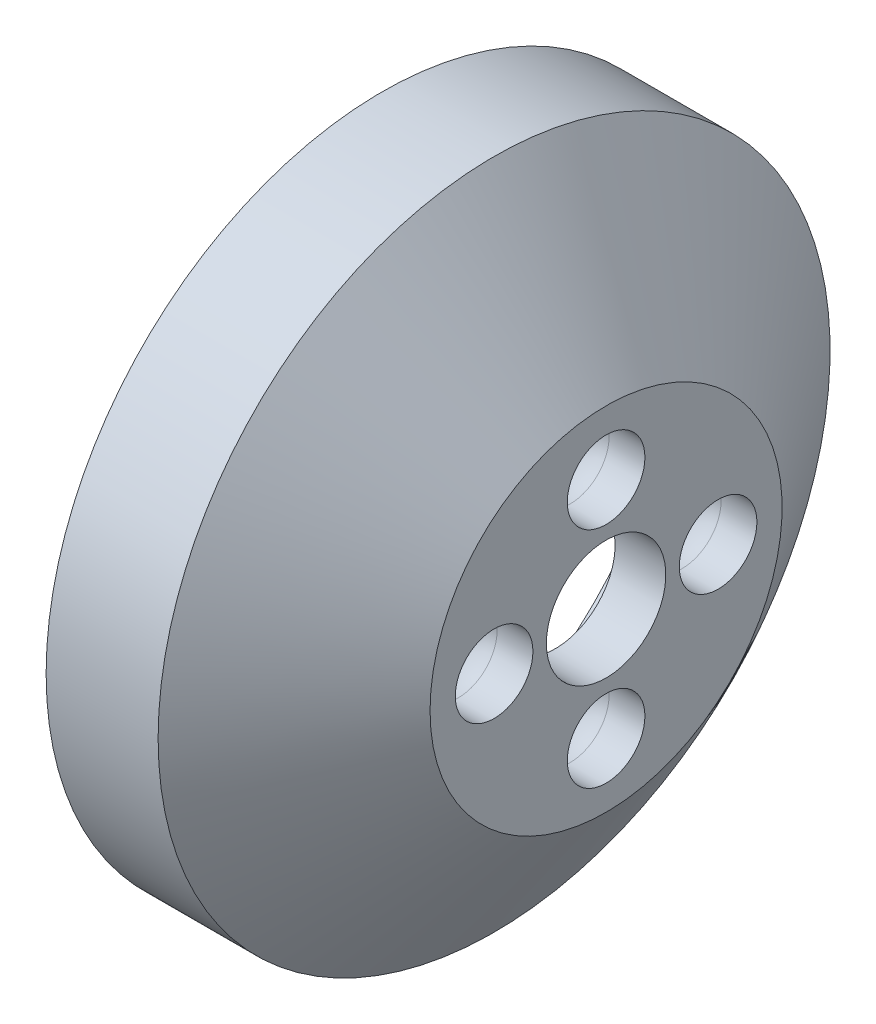
ISO-10303-21;
HEADER;
FILE_DESCRIPTION(('STEP AP214'),'2;1');
FILE_NAME('part.step','',(''),(''),'','','');
FILE_SCHEMA(('AUTOMOTIVE_DESIGN { 1 0 10303 214 1 1 1 1 }'));
ENDSEC;
DATA;
#1=APPLICATION_CONTEXT('core data for automotive mechanical design processes');
#2=APPLICATION_PROTOCOL_DEFINITION('international standard','automotive_design',2000,#1);
#3=PRODUCT_CONTEXT('',#1,'mechanical');
#4=PRODUCT('Part','Part','',(#3));
#5=PRODUCT_RELATED_PRODUCT_CATEGORY('part','',(#4));
#6=PRODUCT_DEFINITION_FORMATION('','',#4);
#7=PRODUCT_DEFINITION_CONTEXT('part definition',#1,'design');
#8=PRODUCT_DEFINITION('design','',#6,#7);
#9=PRODUCT_DEFINITION_SHAPE('','',#8);
#10=(LENGTH_UNIT() NAMED_UNIT(*) SI_UNIT(.MILLI.,.METRE.));
#11=(NAMED_UNIT(*) PLANE_ANGLE_UNIT() SI_UNIT($,.RADIAN.));
#12=(NAMED_UNIT(*) SI_UNIT($,.STERADIAN.) SOLID_ANGLE_UNIT());
#13=UNCERTAINTY_MEASURE_WITH_UNIT(LENGTH_MEASURE(1.E-05),#10,'distance_accuracy_value','');
#14=(GEOMETRIC_REPRESENTATION_CONTEXT(3) GLOBAL_UNCERTAINTY_ASSIGNED_CONTEXT((#13)) GLOBAL_UNIT_ASSIGNED_CONTEXT((#10,
#11,#12)) REPRESENTATION_CONTEXT('',''));
#15=CARTESIAN_POINT('',(0.,0.,0.));
#16=DIRECTION('',(0.,0.,1.));
#17=DIRECTION('',(1.,0.,0.));
#18=AXIS2_PLACEMENT_3D('',#15,#16,#17);
#19=CARTESIAN_POINT('',(0.,0.,0.));
#20=DIRECTION('',(-1.,0.,0.));
#21=DIRECTION('',(0.,0.,1.));
#22=AXIS2_PLACEMENT_3D('',#19,#20,#21);
#23=PLANE('',#22);
#24=CARTESIAN_POINT('',(0.,0.,0.));
#25=DIRECTION('',(-1.,0.,0.));
#26=DIRECTION('',(0.,0.,1.));
#27=AXIS2_PLACEMENT_3D('',#24,#25,#26);
#28=CIRCLE('',#27,43.1800000000001);
#29=CARTESIAN_POINT('',(0.,0.,43.1800000000001));
#30=VERTEX_POINT('',#29);
#31=EDGE_CURVE('E10',#30,#30,#28,.F.);
#32=ORIENTED_EDGE('',*,*,#31,.T.);
#33=EDGE_LOOP('',(#32));
#34=FACE_BOUND('',#33,.T.);
#35=CARTESIAN_POINT('',(0.,0.,0.));
#36=DIRECTION('',(-1.,0.,0.));
#37=DIRECTION('',(0.,0.,1.));
#38=AXIS2_PLACEMENT_3D('',#35,#36,#37);
#39=CIRCLE('',#38,51.054);
#40=CARTESIAN_POINT('',(0.,0.,51.054));
#41=VERTEX_POINT('',#40);
#42=EDGE_CURVE('E93',#41,#41,#39,.T.);
#43=ORIENTED_EDGE('',*,*,#42,.T.);
#44=EDGE_LOOP('',(#43));
#45=FACE_BOUND('',#44,.T.);
#46=ADVANCED_FACE('F40',(#34,#45),#23,.T.);
#47=CARTESIAN_POINT('',(0.,0.,0.));
#48=DIRECTION('',(-1.,0.,0.));
#49=DIRECTION('',(0.,0.,1.));
#50=AXIS2_PLACEMENT_3D('',#47,#48,#49);
#51=CYLINDRICAL_SURFACE('',#50,10.16);
#52=CARTESIAN_POINT('',(23.1208529116846,0.,0.));
#53=DIRECTION('',(-1.,0.,0.));
#54=DIRECTION('',(0.,0.,1.));
#55=AXIS2_PLACEMENT_3D('',#52,#53,#54);
#56=CIRCLE('',#55,10.16);
#57=CARTESIAN_POINT('',(23.1208529116846,0.,10.16));
#58=VERTEX_POINT('',#57);
#59=EDGE_CURVE('E49',#58,#58,#56,.T.);
#60=ORIENTED_EDGE('',*,*,#59,.T.);
#61=EDGE_LOOP('',(#60));
#62=FACE_BOUND('',#61,.T.);
#63=CARTESIAN_POINT('',(31.7500000000003,0.,0.));
#64=DIRECTION('',(-1.,0.,0.));
#65=DIRECTION('',(0.,0.,1.));
#66=AXIS2_PLACEMENT_3D('',#63,#64,#65);
#67=CIRCLE('',#66,10.16);
#68=CARTESIAN_POINT('',(31.7500000000003,0.,10.16));
#69=VERTEX_POINT('',#68);
#70=EDGE_CURVE('E73',#69,#69,#67,.T.);
#71=ORIENTED_EDGE('',*,*,#70,.F.);
#72=EDGE_LOOP('',(#71));
#73=FACE_BOUND('',#72,.T.);
#74=ADVANCED_FACE('F120',(#62,#73),#51,.F.);
#75=CARTESIAN_POINT('',(31.7500000000002,2.94298018459337E-13,0.));
#76=DIRECTION('',(-1.,0.,0.));
#77=DIRECTION('',(0.,0.,1.));
#78=AXIS2_PLACEMENT_3D('',#75,#76,#77);
#79=PLANE('',#78);
#80=CARTESIAN_POINT('',(31.7500000000002,0.,19.05));
#81=DIRECTION('',(1.,0.,0.));
#82=DIRECTION('',(0.,0.,-1.));
#83=AXIS2_PLACEMENT_3D('',#80,#81,#82);
#84=CIRCLE('',#83,6.604);
#85=CARTESIAN_POINT('',(31.7500000000002,0.,12.446));
#86=VERTEX_POINT('',#85);
#87=EDGE_CURVE('E97',#86,#86,#84,.T.);
#88=ORIENTED_EDGE('',*,*,#87,.F.);
#89=EDGE_LOOP('',(#88));
#90=FACE_BOUND('',#89,.T.);
#91=CARTESIAN_POINT('',(31.7500000000002,19.05,0.));
#92=DIRECTION('',(1.,0.,0.));
#93=DIRECTION('',(0.,0.,-1.));
#94=AXIS2_PLACEMENT_3D('',#91,#92,#93);
#95=CIRCLE('',#94,6.604);
#96=CARTESIAN_POINT('',(31.7500000000002,19.05,-6.604));
#97=VERTEX_POINT('',#96);
#98=EDGE_CURVE('E106',#97,#97,#95,.T.);
#99=ORIENTED_EDGE('',*,*,#98,.F.);
#100=EDGE_LOOP('',(#99));
#101=FACE_BOUND('',#100,.T.);
#102=CARTESIAN_POINT('',(31.7500000000002,0.,-19.05));
#103=DIRECTION('',(1.,0.,0.));
#104=DIRECTION('',(0.,0.,-1.));
#105=AXIS2_PLACEMENT_3D('',#102,#103,#104);
#106=CIRCLE('',#105,6.604);
#107=CARTESIAN_POINT('',(31.7500000000002,0.,-25.654));
#108=VERTEX_POINT('',#107);
#109=EDGE_CURVE('E102',#108,#108,#106,.T.);
#110=ORIENTED_EDGE('',*,*,#109,.F.);
#111=EDGE_LOOP('',(#110));
#112=FACE_BOUND('',#111,.T.);
#113=CARTESIAN_POINT('',(31.7500000000002,-19.05,0.));
#114=DIRECTION('',(1.,0.,0.));
#115=DIRECTION('',(0.,0.,-1.));
#116=AXIS2_PLACEMENT_3D('',#113,#114,#115);
#117=CIRCLE('',#116,6.604);
#118=CARTESIAN_POINT('',(31.7500000000002,-19.05,-6.604));
#119=VERTEX_POINT('',#118);
#120=EDGE_CURVE('E98',#119,#119,#117,.T.);
#121=ORIENTED_EDGE('',*,*,#120,.F.);
#122=EDGE_LOOP('',(#121));
#123=FACE_BOUND('',#122,.T.);
#124=CARTESIAN_POINT('',(31.7500000000001,0.,0.));
#125=DIRECTION('',(-1.,0.,0.));
#126=DIRECTION('',(0.,0.,1.));
#127=AXIS2_PLACEMENT_3D('',#124,#125,#126);
#128=CIRCLE('',#127,29.9437804715627);
#129=CARTESIAN_POINT('',(31.7500000000001,0.,29.9437804715627));
#130=VERTEX_POINT('',#129);
#131=EDGE_CURVE('E77',#130,#130,#128,.T.);
#132=ORIENTED_EDGE('',*,*,#131,.F.);
#133=EDGE_LOOP('',(#132));
#134=FACE_BOUND('',#133,.T.);
#135=ORIENTED_EDGE('',*,*,#70,.T.);
#136=EDGE_LOOP('',(#135));
#137=FACE_BOUND('',#136,.T.);
#138=ADVANCED_FACE('F116',(#90,#101,#112,#123,#134,#137),#79,.F.);
#139=CARTESIAN_POINT('',(31.7500000000001,0.,0.));
#140=DIRECTION('',(-1.,0.,0.));
#141=DIRECTION('',(0.,0.,1.));
#142=AXIS2_PLACEMENT_3D('',#139,#140,#141);
#143=CONICAL_SURFACE('',#142,29.9437804715627,0.95993108859688);
#144=CARTESIAN_POINT('',(12.7,0.,0.));
#145=DIRECTION('',(-1.,0.,0.));
#146=DIRECTION('',(0.,0.,1.));
#147=AXIS2_PLACEMENT_3D('',#144,#145,#146);
#148=CIRCLE('',#147,57.15);
#149=CARTESIAN_POINT('',(12.7,0.,57.15));
#150=VERTEX_POINT('',#149);
#151=EDGE_CURVE('E81',#150,#150,#148,.T.);
#152=ORIENTED_EDGE('',*,*,#151,.F.);
#153=EDGE_LOOP('',(#152));
#154=FACE_BOUND('',#153,.T.);
#155=ORIENTED_EDGE('',*,*,#131,.T.);
#156=EDGE_LOOP('',(#155));
#157=FACE_BOUND('',#156,.T.);
#158=ADVANCED_FACE('F119',(#154,#157),#143,.T.);
#159=CARTESIAN_POINT('',(0.,0.,0.));
#160=DIRECTION('',(-1.,0.,0.));
#161=DIRECTION('',(0.,0.,1.));
#162=AXIS2_PLACEMENT_3D('',#159,#160,#161);
#163=CYLINDRICAL_SURFACE('',#162,57.15);
#164=ORIENTED_EDGE('',*,*,#151,.T.);
#165=EDGE_LOOP('',(#164));
#166=FACE_BOUND('',#165,.T.);
#167=CARTESIAN_POINT('',(-6.35000000000001,0.,0.));
#168=DIRECTION('',(-1.,0.,0.));
#169=DIRECTION('',(0.,0.,1.));
#170=AXIS2_PLACEMENT_3D('',#167,#168,#169);
#171=CIRCLE('',#170,57.15);
#172=CARTESIAN_POINT('',(-6.35000000000001,0.,57.15));
#173=VERTEX_POINT('',#172);
#174=EDGE_CURVE('E85',#173,#173,#171,.T.);
#175=ORIENTED_EDGE('',*,*,#174,.F.);
#176=EDGE_LOOP('',(#175));
#177=FACE_BOUND('',#176,.T.);
#178=ADVANCED_FACE('F186',(#166,#177),#163,.T.);
#179=CARTESIAN_POINT('',(-6.35000000000001,0.,0.));
#180=DIRECTION('',(1.,0.,0.));
#181=DIRECTION('',(0.,0.,-1.));
#182=AXIS2_PLACEMENT_3D('',#179,#180,#181);
#183=PLANE('',#182);
#184=CARTESIAN_POINT('',(-6.35000000000001,0.,0.));
#185=DIRECTION('',(-1.,0.,0.));
#186=DIRECTION('',(0.,0.,1.));
#187=AXIS2_PLACEMENT_3D('',#184,#185,#186);
#188=CIRCLE('',#187,51.054);
#189=CARTESIAN_POINT('',(-6.35000000000001,0.,51.054));
#190=VERTEX_POINT('',#189);
#191=EDGE_CURVE('E89',#190,#190,#188,.T.);
#192=ORIENTED_EDGE('',*,*,#191,.F.);
#193=EDGE_LOOP('',(#192));
#194=FACE_BOUND('',#193,.T.);
#195=ORIENTED_EDGE('',*,*,#174,.T.);
#196=EDGE_LOOP('',(#195));
#197=FACE_BOUND('',#196,.T.);
#198=ADVANCED_FACE('F182',(#194,#197),#183,.F.);
#199=CARTESIAN_POINT('',(0.,0.,0.));
#200=DIRECTION('',(-1.,0.,0.));
#201=DIRECTION('',(0.,0.,1.));
#202=AXIS2_PLACEMENT_3D('',#199,#200,#201);
#203=CYLINDRICAL_SURFACE('',#202,51.054);
#204=ORIENTED_EDGE('',*,*,#191,.T.);
#205=EDGE_LOOP('',(#204));
#206=FACE_BOUND('',#205,.T.);
#207=ORIENTED_EDGE('',*,*,#42,.F.);
#208=EDGE_LOOP('',(#207));
#209=FACE_BOUND('',#208,.T.);
#210=ADVANCED_FACE('F178',(#206,#209),#203,.F.);
#211=CARTESIAN_POINT('',(19.0500000000002,-19.05,0.));
#212=DIRECTION('',(1.,0.,0.));
#213=DIRECTION('',(0.,0.,-1.));
#214=AXIS2_PLACEMENT_3D('',#211,#212,#213);
#215=CYLINDRICAL_SURFACE('',#214,6.604);
#216=CARTESIAN_POINT('',(25.6540000000002,-19.05,0.));
#217=DIRECTION('',(1.,0.,0.));
#218=DIRECTION('',(0.,0.,-1.));
#219=AXIS2_PLACEMENT_3D('',#216,#217,#218);
#220=CIRCLE('',#219,6.604);
#221=CARTESIAN_POINT('',(25.6540000000002,-19.05,-6.604));
#222=VERTEX_POINT('',#221);
#223=EDGE_CURVE('E69',#222,#222,#220,.F.);
#224=CARTESIAN_POINT('',(25.6540000000002,-19.05,-6.604));
#225=CARTESIAN_POINT('',(25.7175000000002,-19.05,-6.604));
#226=CARTESIAN_POINT('',(25.7810000000002,-19.05,-6.604));
#227=CARTESIAN_POINT('',(25.9080000000002,-19.05,-6.604));
#228=CARTESIAN_POINT('',(25.9715000000002,-19.05,-6.604));
#229=CARTESIAN_POINT('',(26.0985000000002,-19.05,-6.604));
#230=CARTESIAN_POINT('',(26.1620000000002,-19.05,-6.604));
#231=CARTESIAN_POINT('',(26.2890000000002,-19.05,-6.604));
#232=CARTESIAN_POINT('',(26.3525000000002,-19.05,-6.604));
#233=CARTESIAN_POINT('',(26.4795000000002,-19.05,-6.604));
#234=CARTESIAN_POINT('',(26.5430000000002,-19.05,-6.604));
#235=CARTESIAN_POINT('',(26.6700000000002,-19.05,-6.604));
#236=CARTESIAN_POINT('',(26.7335000000002,-19.05,-6.604));
#237=CARTESIAN_POINT('',(26.8605000000002,-19.05,-6.604));
#238=CARTESIAN_POINT('',(26.9240000000002,-19.05,-6.604));
#239=CARTESIAN_POINT('',(27.0510000000002,-19.05,-6.604));
#240=CARTESIAN_POINT('',(27.1145000000002,-19.05,-6.604));
#241=CARTESIAN_POINT('',(27.2415000000002,-19.05,-6.604));
#242=CARTESIAN_POINT('',(27.3050000000002,-19.05,-6.604));
#243=CARTESIAN_POINT('',(27.4320000000002,-19.05,-6.604));
#244=CARTESIAN_POINT('',(27.4955000000002,-19.05,-6.604));
#245=CARTESIAN_POINT('',(27.6225000000002,-19.05,-6.604));
#246=CARTESIAN_POINT('',(27.6860000000002,-19.05,-6.604));
#247=CARTESIAN_POINT('',(27.8130000000002,-19.05,-6.604));
#248=CARTESIAN_POINT('',(27.8765000000002,-19.05,-6.604));
#249=CARTESIAN_POINT('',(28.0035000000002,-19.05,-6.604));
#250=CARTESIAN_POINT('',(28.0670000000002,-19.05,-6.604));
#251=CARTESIAN_POINT('',(28.1940000000002,-19.05,-6.604));
#252=CARTESIAN_POINT('',(28.2575000000002,-19.05,-6.604));
#253=CARTESIAN_POINT('',(28.3845000000002,-19.05,-6.604));
#254=CARTESIAN_POINT('',(28.4480000000002,-19.05,-6.604));
#255=CARTESIAN_POINT('',(28.5750000000002,-19.05,-6.604));
#256=CARTESIAN_POINT('',(28.6385000000002,-19.05,-6.604));
#257=CARTESIAN_POINT('',(28.7655000000002,-19.05,-6.604));
#258=CARTESIAN_POINT('',(28.8290000000002,-19.05,-6.604));
#259=CARTESIAN_POINT('',(28.9560000000002,-19.05,-6.604));
#260=CARTESIAN_POINT('',(29.0195000000002,-19.05,-6.604));
#261=CARTESIAN_POINT('',(29.1465000000002,-19.05,-6.604));
#262=CARTESIAN_POINT('',(29.2100000000002,-19.05,-6.604));
#263=CARTESIAN_POINT('',(29.3370000000002,-19.05,-6.604));
#264=CARTESIAN_POINT('',(29.4005000000002,-19.05,-6.604));
#265=CARTESIAN_POINT('',(29.5275000000002,-19.05,-6.604));
#266=CARTESIAN_POINT('',(29.5910000000002,-19.05,-6.604));
#267=CARTESIAN_POINT('',(29.7180000000002,-19.05,-6.604));
#268=CARTESIAN_POINT('',(29.7815000000002,-19.05,-6.604));
#269=CARTESIAN_POINT('',(29.9085000000002,-19.05,-6.604));
#270=CARTESIAN_POINT('',(29.9720000000002,-19.05,-6.604));
#271=CARTESIAN_POINT('',(30.0990000000002,-19.05,-6.604));
#272=CARTESIAN_POINT('',(30.1625000000002,-19.05,-6.604));
#273=CARTESIAN_POINT('',(30.2895000000002,-19.05,-6.604));
#274=CARTESIAN_POINT('',(30.3530000000002,-19.05,-6.604));
#275=CARTESIAN_POINT('',(30.4800000000002,-19.05,-6.604));
#276=CARTESIAN_POINT('',(30.5435000000002,-19.05,-6.604));
#277=CARTESIAN_POINT('',(30.6705000000002,-19.05,-6.604));
#278=CARTESIAN_POINT('',(30.7340000000002,-19.05,-6.604));
#279=CARTESIAN_POINT('',(30.8610000000002,-19.05,-6.604));
#280=CARTESIAN_POINT('',(30.9245000000002,-19.05,-6.604));
#281=CARTESIAN_POINT('',(31.0515000000002,-19.05,-6.604));
#282=CARTESIAN_POINT('',(31.1150000000002,-19.05,-6.604));
#283=CARTESIAN_POINT('',(31.2420000000002,-19.05,-6.604));
#284=CARTESIAN_POINT('',(31.3055000000002,-19.05,-6.604));
#285=CARTESIAN_POINT('',(31.4325000000002,-19.05,-6.604));
#286=CARTESIAN_POINT('',(31.4960000000002,-19.05,-6.604));
#287=CARTESIAN_POINT('',(31.6230000000002,-19.05,-6.604));
#288=CARTESIAN_POINT('',(31.6865000000002,-19.05,-6.604));
#289=CARTESIAN_POINT('',(31.7500000000002,-19.05,-6.604));
#290=B_SPLINE_CURVE_WITH_KNOTS('',3,(#224,#225,#226,#227,#228,#229,#230,#231,#232,#233,#234,
#235,#236,#237,#238,#239,#240,#241,#242,#243,#244,#245,#246,#247,#248,#249,#250,#251,#252,#253,
#254,#255,#256,#257,#258,#259,#260,#261,#262,#263,#264,#265,#266,#267,#268,#269,#270,#271,#272,
#273,#274,#275,#276,#277,#278,#279,#280,#281,#282,#283,#284,#285,#286,#287,#288,#289),
.UNSPECIFIED.,.F.,.F.,(4,2,2,2,2,2,2,2,2,2,2,2,2,2,2,2,2,2,2,2,2,2,2,2,2,2,2,2,2,2,2,2,4),(0.,
0.1905,0.381000000000003,0.571499999999999,0.762000000000002,0.952500000000002,1.143,1.3335,
1.524,1.7145,1.905,2.0955,2.286,2.4765,2.667,2.8575,3.048,3.2385,3.429,3.6195,3.81,4.0005,4.191,
4.3815,4.572,4.7625,4.953,5.1435,5.334,5.52450000000001,5.715,5.9055,6.096),.UNSPECIFIED.);
#291=EDGE_CURVE('BSEAM172',#222,#119,#290,.T.);
#292=ORIENTED_EDGE('',*,*,#223,.T.);
#293=ORIENTED_EDGE('',*,*,#120,.T.);
#294=ORIENTED_EDGE('',*,*,#291,.T.);
#295=ORIENTED_EDGE('',*,*,#291,.F.);
#296=EDGE_LOOP('',(#292,#294,#293,#295));
#297=FACE_BOUND('',#296,.T.);
#298=ADVANCED_FACE('F172',(#297),#215,.F.);
#299=CARTESIAN_POINT('',(19.0500000000002,0.,-19.05));
#300=DIRECTION('',(1.,0.,0.));
#301=DIRECTION('',(0.,0.,-1.));
#302=AXIS2_PLACEMENT_3D('',#299,#300,#301);
#303=CYLINDRICAL_SURFACE('',#302,6.604);
#304=CARTESIAN_POINT('',(25.6540000000002,0.,-19.05));
#305=DIRECTION('',(1.,0.,0.));
#306=DIRECTION('',(0.,0.,-1.));
#307=AXIS2_PLACEMENT_3D('',#304,#305,#306);
#308=CIRCLE('',#307,6.604);
#309=CARTESIAN_POINT('',(25.6540000000002,0.,-25.654));
#310=VERTEX_POINT('',#309);
#311=EDGE_CURVE('E65',#310,#310,#308,.F.);
#312=CARTESIAN_POINT('',(25.6540000000002,0.,-25.654));
#313=CARTESIAN_POINT('',(25.7175000000002,0.,-25.654));
#314=CARTESIAN_POINT('',(25.7810000000002,0.,-25.654));
#315=CARTESIAN_POINT('',(25.9080000000002,0.,-25.654));
#316=CARTESIAN_POINT('',(25.9715000000002,0.,-25.654));
#317=CARTESIAN_POINT('',(26.0985000000002,0.,-25.654));
#318=CARTESIAN_POINT('',(26.1620000000002,0.,-25.654));
#319=CARTESIAN_POINT('',(26.2890000000002,0.,-25.654));
#320=CARTESIAN_POINT('',(26.3525000000002,0.,-25.654));
#321=CARTESIAN_POINT('',(26.4795000000002,0.,-25.654));
#322=CARTESIAN_POINT('',(26.5430000000002,0.,-25.654));
#323=CARTESIAN_POINT('',(26.6700000000002,0.,-25.654));
#324=CARTESIAN_POINT('',(26.7335000000002,0.,-25.654));
#325=CARTESIAN_POINT('',(26.8605000000002,0.,-25.654));
#326=CARTESIAN_POINT('',(26.9240000000002,0.,-25.654));
#327=CARTESIAN_POINT('',(27.0510000000002,0.,-25.654));
#328=CARTESIAN_POINT('',(27.1145000000002,0.,-25.654));
#329=CARTESIAN_POINT('',(27.2415000000002,0.,-25.654));
#330=CARTESIAN_POINT('',(27.3050000000002,0.,-25.654));
#331=CARTESIAN_POINT('',(27.4320000000002,0.,-25.654));
#332=CARTESIAN_POINT('',(27.4955000000002,0.,-25.654));
#333=CARTESIAN_POINT('',(27.6225000000002,0.,-25.654));
#334=CARTESIAN_POINT('',(27.6860000000002,0.,-25.654));
#335=CARTESIAN_POINT('',(27.8130000000002,0.,-25.654));
#336=CARTESIAN_POINT('',(27.8765000000002,0.,-25.654));
#337=CARTESIAN_POINT('',(28.0035000000002,0.,-25.654));
#338=CARTESIAN_POINT('',(28.0670000000002,0.,-25.654));
#339=CARTESIAN_POINT('',(28.1940000000002,0.,-25.654));
#340=CARTESIAN_POINT('',(28.2575000000002,0.,-25.654));
#341=CARTESIAN_POINT('',(28.3845000000002,0.,-25.654));
#342=CARTESIAN_POINT('',(28.4480000000002,0.,-25.654));
#343=CARTESIAN_POINT('',(28.5750000000002,0.,-25.654));
#344=CARTESIAN_POINT('',(28.6385000000002,0.,-25.654));
#345=CARTESIAN_POINT('',(28.7655000000002,0.,-25.654));
#346=CARTESIAN_POINT('',(28.8290000000002,0.,-25.654));
#347=CARTESIAN_POINT('',(28.9560000000002,0.,-25.654));
#348=CARTESIAN_POINT('',(29.0195000000002,0.,-25.654));
#349=CARTESIAN_POINT('',(29.1465000000002,0.,-25.654));
#350=CARTESIAN_POINT('',(29.2100000000002,0.,-25.654));
#351=CARTESIAN_POINT('',(29.3370000000002,0.,-25.654));
#352=CARTESIAN_POINT('',(29.4005000000002,0.,-25.654));
#353=CARTESIAN_POINT('',(29.5275000000002,0.,-25.654));
#354=CARTESIAN_POINT('',(29.5910000000002,0.,-25.654));
#355=CARTESIAN_POINT('',(29.7180000000002,0.,-25.654));
#356=CARTESIAN_POINT('',(29.7815000000002,0.,-25.654));
#357=CARTESIAN_POINT('',(29.9085000000002,0.,-25.654));
#358=CARTESIAN_POINT('',(29.9720000000002,0.,-25.654));
#359=CARTESIAN_POINT('',(30.0990000000002,0.,-25.654));
#360=CARTESIAN_POINT('',(30.1625000000002,0.,-25.654));
#361=CARTESIAN_POINT('',(30.2895000000002,0.,-25.654));
#362=CARTESIAN_POINT('',(30.3530000000002,0.,-25.654));
#363=CARTESIAN_POINT('',(30.4800000000002,0.,-25.654));
#364=CARTESIAN_POINT('',(30.5435000000002,0.,-25.654));
#365=CARTESIAN_POINT('',(30.6705000000002,0.,-25.654));
#366=CARTESIAN_POINT('',(30.7340000000002,0.,-25.654));
#367=CARTESIAN_POINT('',(30.8610000000002,0.,-25.654));
#368=CARTESIAN_POINT('',(30.9245000000002,0.,-25.654));
#369=CARTESIAN_POINT('',(31.0515000000002,0.,-25.654));
#370=CARTESIAN_POINT('',(31.1150000000002,0.,-25.654));
#371=CARTESIAN_POINT('',(31.2420000000002,0.,-25.654));
#372=CARTESIAN_POINT('',(31.3055000000002,0.,-25.654));
#373=CARTESIAN_POINT('',(31.4325000000002,0.,-25.654));
#374=CARTESIAN_POINT('',(31.4960000000002,0.,-25.654));
#375=CARTESIAN_POINT('',(31.6230000000002,0.,-25.654));
#376=CARTESIAN_POINT('',(31.6865000000002,0.,-25.654));
#377=CARTESIAN_POINT('',(31.7500000000002,0.,-25.654));
#378=B_SPLINE_CURVE_WITH_KNOTS('',3,(#312,#313,#314,#315,#316,#317,#318,#319,#320,#321,#322,
#323,#324,#325,#326,#327,#328,#329,#330,#331,#332,#333,#334,#335,#336,#337,#338,#339,#340,#341,
#342,#343,#344,#345,#346,#347,#348,#349,#350,#351,#352,#353,#354,#355,#356,#357,#358,#359,#360,
#361,#362,#363,#364,#365,#366,#367,#368,#369,#370,#371,#372,#373,#374,#375,#376,#377),
.UNSPECIFIED.,.F.,.F.,(4,2,2,2,2,2,2,2,2,2,2,2,2,2,2,2,2,2,2,2,2,2,2,2,2,2,2,2,2,2,2,2,4),(0.,
0.1905,0.381000000000003,0.571499999999999,0.762000000000002,0.952500000000002,1.143,1.3335,
1.524,1.7145,1.905,2.0955,2.286,2.4765,2.667,2.8575,3.048,3.2385,3.429,3.6195,3.81,4.0005,4.191,
4.3815,4.572,4.7625,4.953,5.1435,5.334,5.52450000000001,5.715,5.9055,6.096),.UNSPECIFIED.);
#379=EDGE_CURVE('BSEAM164',#310,#108,#378,.T.);
#380=ORIENTED_EDGE('',*,*,#311,.T.);
#381=ORIENTED_EDGE('',*,*,#109,.T.);
#382=ORIENTED_EDGE('',*,*,#379,.T.);
#383=ORIENTED_EDGE('',*,*,#379,.F.);
#384=EDGE_LOOP('',(#380,#382,#381,#383));
#385=FACE_BOUND('',#384,.T.);
#386=ADVANCED_FACE('F164',(#385),#303,.F.);
#387=CARTESIAN_POINT('',(19.0500000000002,19.05,0.));
#388=DIRECTION('',(1.,0.,0.));
#389=DIRECTION('',(0.,0.,-1.));
#390=AXIS2_PLACEMENT_3D('',#387,#388,#389);
#391=CYLINDRICAL_SURFACE('',#390,6.604);
#392=CARTESIAN_POINT('',(25.6540000000002,19.05,0.));
#393=DIRECTION('',(1.,0.,0.));
#394=DIRECTION('',(0.,0.,-1.));
#395=AXIS2_PLACEMENT_3D('',#392,#393,#394);
#396=CIRCLE('',#395,6.604);
#397=CARTESIAN_POINT('',(25.6540000000002,19.05,-6.604));
#398=VERTEX_POINT('',#397);
#399=EDGE_CURVE('E54',#398,#398,#396,.F.);
#400=CARTESIAN_POINT('',(25.6540000000002,19.05,-6.604));
#401=CARTESIAN_POINT('',(25.7175000000002,19.05,-6.604));
#402=CARTESIAN_POINT('',(25.7810000000002,19.05,-6.604));
#403=CARTESIAN_POINT('',(25.9080000000002,19.05,-6.604));
#404=CARTESIAN_POINT('',(25.9715000000002,19.05,-6.604));
#405=CARTESIAN_POINT('',(26.0985000000002,19.05,-6.604));
#406=CARTESIAN_POINT('',(26.1620000000002,19.05,-6.604));
#407=CARTESIAN_POINT('',(26.2890000000002,19.05,-6.604));
#408=CARTESIAN_POINT('',(26.3525000000002,19.05,-6.604));
#409=CARTESIAN_POINT('',(26.4795000000002,19.05,-6.604));
#410=CARTESIAN_POINT('',(26.5430000000002,19.05,-6.604));
#411=CARTESIAN_POINT('',(26.6700000000002,19.05,-6.604));
#412=CARTESIAN_POINT('',(26.7335000000002,19.05,-6.604));
#413=CARTESIAN_POINT('',(26.8605000000002,19.05,-6.604));
#414=CARTESIAN_POINT('',(26.9240000000002,19.05,-6.604));
#415=CARTESIAN_POINT('',(27.0510000000002,19.05,-6.604));
#416=CARTESIAN_POINT('',(27.1145000000002,19.05,-6.604));
#417=CARTESIAN_POINT('',(27.2415000000002,19.05,-6.604));
#418=CARTESIAN_POINT('',(27.3050000000002,19.05,-6.604));
#419=CARTESIAN_POINT('',(27.4320000000002,19.05,-6.604));
#420=CARTESIAN_POINT('',(27.4955000000002,19.05,-6.604));
#421=CARTESIAN_POINT('',(27.6225000000002,19.05,-6.604));
#422=CARTESIAN_POINT('',(27.6860000000002,19.05,-6.604));
#423=CARTESIAN_POINT('',(27.8130000000002,19.05,-6.604));
#424=CARTESIAN_POINT('',(27.8765000000002,19.05,-6.604));
#425=CARTESIAN_POINT('',(28.0035000000002,19.05,-6.604));
#426=CARTESIAN_POINT('',(28.0670000000002,19.05,-6.604));
#427=CARTESIAN_POINT('',(28.1940000000002,19.05,-6.604));
#428=CARTESIAN_POINT('',(28.2575000000002,19.05,-6.604));
#429=CARTESIAN_POINT('',(28.3845000000002,19.05,-6.604));
#430=CARTESIAN_POINT('',(28.4480000000002,19.05,-6.604));
#431=CARTESIAN_POINT('',(28.5750000000002,19.05,-6.604));
#432=CARTESIAN_POINT('',(28.6385000000002,19.05,-6.604));
#433=CARTESIAN_POINT('',(28.7655000000002,19.05,-6.604));
#434=CARTESIAN_POINT('',(28.8290000000002,19.05,-6.604));
#435=CARTESIAN_POINT('',(28.9560000000002,19.05,-6.604));
#436=CARTESIAN_POINT('',(29.0195000000002,19.05,-6.604));
#437=CARTESIAN_POINT('',(29.1465000000002,19.05,-6.604));
#438=CARTESIAN_POINT('',(29.2100000000002,19.05,-6.604));
#439=CARTESIAN_POINT('',(29.3370000000002,19.05,-6.604));
#440=CARTESIAN_POINT('',(29.4005000000002,19.05,-6.604));
#441=CARTESIAN_POINT('',(29.5275000000002,19.05,-6.604));
#442=CARTESIAN_POINT('',(29.5910000000002,19.05,-6.604));
#443=CARTESIAN_POINT('',(29.7180000000002,19.05,-6.604));
#444=CARTESIAN_POINT('',(29.7815000000002,19.05,-6.604));
#445=CARTESIAN_POINT('',(29.9085000000002,19.05,-6.604));
#446=CARTESIAN_POINT('',(29.9720000000002,19.05,-6.604));
#447=CARTESIAN_POINT('',(30.0990000000002,19.05,-6.604));
#448=CARTESIAN_POINT('',(30.1625000000002,19.05,-6.604));
#449=CARTESIAN_POINT('',(30.2895000000002,19.05,-6.604));
#450=CARTESIAN_POINT('',(30.3530000000002,19.05,-6.604));
#451=CARTESIAN_POINT('',(30.4800000000002,19.05,-6.604));
#452=CARTESIAN_POINT('',(30.5435000000002,19.05,-6.604));
#453=CARTESIAN_POINT('',(30.6705000000002,19.05,-6.604));
#454=CARTESIAN_POINT('',(30.7340000000002,19.05,-6.604));
#455=CARTESIAN_POINT('',(30.8610000000002,19.05,-6.604));
#456=CARTESIAN_POINT('',(30.9245000000002,19.05,-6.604));
#457=CARTESIAN_POINT('',(31.0515000000002,19.05,-6.604));
#458=CARTESIAN_POINT('',(31.1150000000002,19.05,-6.604));
#459=CARTESIAN_POINT('',(31.2420000000002,19.05,-6.604));
#460=CARTESIAN_POINT('',(31.3055000000002,19.05,-6.604));
#461=CARTESIAN_POINT('',(31.4325000000002,19.05,-6.604));
#462=CARTESIAN_POINT('',(31.4960000000002,19.05,-6.604));
#463=CARTESIAN_POINT('',(31.6230000000002,19.05,-6.604));
#464=CARTESIAN_POINT('',(31.6865000000002,19.05,-6.604));
#465=CARTESIAN_POINT('',(31.7500000000002,19.05,-6.604));
#466=B_SPLINE_CURVE_WITH_KNOTS('',3,(#400,#401,#402,#403,#404,#405,#406,#407,#408,#409,#410,
#411,#412,#413,#414,#415,#416,#417,#418,#419,#420,#421,#422,#423,#424,#425,#426,#427,#428,#429,
#430,#431,#432,#433,#434,#435,#436,#437,#438,#439,#440,#441,#442,#443,#444,#445,#446,#447,#448,
#449,#450,#451,#452,#453,#454,#455,#456,#457,#458,#459,#460,#461,#462,#463,#464,#465),
.UNSPECIFIED.,.F.,.F.,(4,2,2,2,2,2,2,2,2,2,2,2,2,2,2,2,2,2,2,2,2,2,2,2,2,2,2,2,2,2,2,2,4),(0.,
0.1905,0.381000000000003,0.571499999999999,0.762000000000002,0.952500000000002,1.143,1.3335,
1.524,1.7145,1.905,2.0955,2.286,2.4765,2.667,2.8575,3.048,3.2385,3.429,3.6195,3.81,4.0005,4.191,
4.3815,4.572,4.7625,4.953,5.1435,5.334,5.52450000000001,5.715,5.9055,6.096),.UNSPECIFIED.);
#467=EDGE_CURVE('BSEAM161',#398,#97,#466,.T.);
#468=ORIENTED_EDGE('',*,*,#399,.T.);
#469=ORIENTED_EDGE('',*,*,#98,.T.);
#470=ORIENTED_EDGE('',*,*,#467,.T.);
#471=ORIENTED_EDGE('',*,*,#467,.F.);
#472=EDGE_LOOP('',(#468,#470,#469,#471));
#473=FACE_BOUND('',#472,.T.);
#474=ADVANCED_FACE('F161',(#473),#391,.F.);
#475=CARTESIAN_POINT('',(19.0500000000002,0.,19.05));
#476=DIRECTION('',(1.,0.,0.));
#477=DIRECTION('',(0.,0.,-1.));
#478=AXIS2_PLACEMENT_3D('',#475,#476,#477);
#479=CYLINDRICAL_SURFACE('',#478,6.604);
#480=CARTESIAN_POINT('',(25.6540000000002,0.,19.05));
#481=DIRECTION('',(1.,0.,0.));
#482=DIRECTION('',(0.,0.,-1.));
#483=AXIS2_PLACEMENT_3D('',#480,#481,#482);
#484=CIRCLE('',#483,6.604);
#485=CARTESIAN_POINT('',(25.6540000000002,0.,12.446));
#486=VERTEX_POINT('',#485);
#487=EDGE_CURVE('E59',#486,#486,#484,.F.);
#488=CARTESIAN_POINT('',(25.6540000000002,0.,12.446));
#489=CARTESIAN_POINT('',(25.7175000000002,0.,12.446));
#490=CARTESIAN_POINT('',(25.7810000000002,0.,12.446));
#491=CARTESIAN_POINT('',(25.9080000000002,0.,12.446));
#492=CARTESIAN_POINT('',(25.9715000000002,0.,12.446));
#493=CARTESIAN_POINT('',(26.0985000000002,0.,12.446));
#494=CARTESIAN_POINT('',(26.1620000000002,0.,12.446));
#495=CARTESIAN_POINT('',(26.2890000000002,0.,12.446));
#496=CARTESIAN_POINT('',(26.3525000000002,0.,12.446));
#497=CARTESIAN_POINT('',(26.4795000000002,0.,12.446));
#498=CARTESIAN_POINT('',(26.5430000000002,0.,12.446));
#499=CARTESIAN_POINT('',(26.6700000000002,0.,12.446));
#500=CARTESIAN_POINT('',(26.7335000000002,0.,12.446));
#501=CARTESIAN_POINT('',(26.8605000000002,0.,12.446));
#502=CARTESIAN_POINT('',(26.9240000000002,0.,12.446));
#503=CARTESIAN_POINT('',(27.0510000000002,0.,12.446));
#504=CARTESIAN_POINT('',(27.1145000000002,0.,12.446));
#505=CARTESIAN_POINT('',(27.2415000000002,0.,12.446));
#506=CARTESIAN_POINT('',(27.3050000000002,0.,12.446));
#507=CARTESIAN_POINT('',(27.4320000000002,0.,12.446));
#508=CARTESIAN_POINT('',(27.4955000000002,0.,12.446));
#509=CARTESIAN_POINT('',(27.6225000000002,0.,12.446));
#510=CARTESIAN_POINT('',(27.6860000000002,0.,12.446));
#511=CARTESIAN_POINT('',(27.8130000000002,0.,12.446));
#512=CARTESIAN_POINT('',(27.8765000000002,0.,12.446));
#513=CARTESIAN_POINT('',(28.0035000000002,0.,12.446));
#514=CARTESIAN_POINT('',(28.0670000000002,0.,12.446));
#515=CARTESIAN_POINT('',(28.1940000000002,0.,12.446));
#516=CARTESIAN_POINT('',(28.2575000000002,0.,12.446));
#517=CARTESIAN_POINT('',(28.3845000000002,0.,12.446));
#518=CARTESIAN_POINT('',(28.4480000000002,0.,12.446));
#519=CARTESIAN_POINT('',(28.5750000000002,0.,12.446));
#520=CARTESIAN_POINT('',(28.6385000000002,0.,12.446));
#521=CARTESIAN_POINT('',(28.7655000000002,0.,12.446));
#522=CARTESIAN_POINT('',(28.8290000000002,0.,12.446));
#523=CARTESIAN_POINT('',(28.9560000000002,0.,12.446));
#524=CARTESIAN_POINT('',(29.0195000000002,0.,12.446));
#525=CARTESIAN_POINT('',(29.1465000000002,0.,12.446));
#526=CARTESIAN_POINT('',(29.2100000000002,0.,12.446));
#527=CARTESIAN_POINT('',(29.3370000000002,0.,12.446));
#528=CARTESIAN_POINT('',(29.4005000000002,0.,12.446));
#529=CARTESIAN_POINT('',(29.5275000000002,0.,12.446));
#530=CARTESIAN_POINT('',(29.5910000000002,0.,12.446));
#531=CARTESIAN_POINT('',(29.7180000000002,0.,12.446));
#532=CARTESIAN_POINT('',(29.7815000000002,0.,12.446));
#533=CARTESIAN_POINT('',(29.9085000000002,0.,12.446));
#534=CARTESIAN_POINT('',(29.9720000000002,0.,12.446));
#535=CARTESIAN_POINT('',(30.0990000000002,0.,12.446));
#536=CARTESIAN_POINT('',(30.1625000000002,0.,12.446));
#537=CARTESIAN_POINT('',(30.2895000000002,0.,12.446));
#538=CARTESIAN_POINT('',(30.3530000000002,0.,12.446));
#539=CARTESIAN_POINT('',(30.4800000000002,0.,12.446));
#540=CARTESIAN_POINT('',(30.5435000000002,0.,12.446));
#541=CARTESIAN_POINT('',(30.6705000000002,0.,12.446));
#542=CARTESIAN_POINT('',(30.7340000000002,0.,12.446));
#543=CARTESIAN_POINT('',(30.8610000000002,0.,12.446));
#544=CARTESIAN_POINT('',(30.9245000000002,0.,12.446));
#545=CARTESIAN_POINT('',(31.0515000000002,0.,12.446));
#546=CARTESIAN_POINT('',(31.1150000000002,0.,12.446));
#547=CARTESIAN_POINT('',(31.2420000000002,0.,12.446));
#548=CARTESIAN_POINT('',(31.3055000000002,0.,12.446));
#549=CARTESIAN_POINT('',(31.4325000000002,0.,12.446));
#550=CARTESIAN_POINT('',(31.4960000000002,0.,12.446));
#551=CARTESIAN_POINT('',(31.6230000000002,0.,12.446));
#552=CARTESIAN_POINT('',(31.6865000000002,0.,12.446));
#553=CARTESIAN_POINT('',(31.7500000000002,0.,12.446));
#554=B_SPLINE_CURVE_WITH_KNOTS('',3,(#488,#489,#490,#491,#492,#493,#494,#495,#496,#497,#498,
#499,#500,#501,#502,#503,#504,#505,#506,#507,#508,#509,#510,#511,#512,#513,#514,#515,#516,#517,
#518,#519,#520,#521,#522,#523,#524,#525,#526,#527,#528,#529,#530,#531,#532,#533,#534,#535,#536,
#537,#538,#539,#540,#541,#542,#543,#544,#545,#546,#547,#548,#549,#550,#551,#552,#553),
.UNSPECIFIED.,.F.,.F.,(4,2,2,2,2,2,2,2,2,2,2,2,2,2,2,2,2,2,2,2,2,2,2,2,2,2,2,2,2,2,2,2,4),(0.,
0.1905,0.381000000000003,0.571499999999999,0.762000000000002,0.952500000000002,1.143,1.3335,
1.524,1.7145,1.905,2.0955,2.286,2.4765,2.667,2.8575,3.048,3.2385,3.429,3.6195,3.81,4.0005,4.191,
4.3815,4.572,4.7625,4.953,5.1435,5.334,5.52450000000001,5.715,5.9055,6.096),.UNSPECIFIED.);
#555=EDGE_CURVE('BSEAM114',#486,#86,#554,.T.);
#556=ORIENTED_EDGE('',*,*,#487,.T.);
#557=ORIENTED_EDGE('',*,*,#87,.T.);
#558=ORIENTED_EDGE('',*,*,#555,.T.);
#559=ORIENTED_EDGE('',*,*,#555,.F.);
#560=EDGE_LOOP('',(#556,#558,#557,#559));
#561=FACE_BOUND('',#560,.T.);
#562=ADVANCED_FACE('F114',(#561),#479,.F.);
#563=CARTESIAN_POINT('',(25.6540000000002,-19.05,0.));
#564=DIRECTION('',(1.,0.,0.));
#565=DIRECTION('',(0.,0.,-1.));
#566=AXIS2_PLACEMENT_3D('',#563,#564,#565);
#567=SPHERICAL_SURFACE('',#566,6.604);
#568=ORIENTED_EDGE('',*,*,#223,.F.);
#569=EDGE_LOOP('',(#568));
#570=FACE_BOUND('',#569,.T.);
#571=ADVANCED_FACE('F141',(#570),#567,.F.);
#572=CARTESIAN_POINT('',(25.6540000000002,0.,-19.05));
#573=DIRECTION('',(1.,0.,0.));
#574=DIRECTION('',(0.,0.,-1.));
#575=AXIS2_PLACEMENT_3D('',#572,#573,#574);
#576=SPHERICAL_SURFACE('',#575,6.604);
#577=ORIENTED_EDGE('',*,*,#311,.F.);
#578=EDGE_LOOP('',(#577));
#579=FACE_BOUND('',#578,.T.);
#580=ADVANCED_FACE('F144',(#579),#576,.F.);
#581=CARTESIAN_POINT('',(25.6540000000002,0.,19.05));
#582=DIRECTION('',(1.,0.,0.));
#583=DIRECTION('',(0.,0.,-1.));
#584=AXIS2_PLACEMENT_3D('',#581,#582,#583);
#585=SPHERICAL_SURFACE('',#584,6.604);
#586=ORIENTED_EDGE('',*,*,#487,.F.);
#587=EDGE_LOOP('',(#586));
#588=FACE_BOUND('',#587,.T.);
#589=ADVANCED_FACE('F148',(#588),#585,.F.);
#590=CARTESIAN_POINT('',(25.6540000000002,19.05,0.));
#591=DIRECTION('',(1.,0.,0.));
#592=DIRECTION('',(0.,0.,-1.));
#593=AXIS2_PLACEMENT_3D('',#590,#591,#592);
#594=SPHERICAL_SURFACE('',#593,6.604);
#595=ORIENTED_EDGE('',*,*,#399,.F.);
#596=EDGE_LOOP('',(#595));
#597=FACE_BOUND('',#596,.T.);
#598=ADVANCED_FACE('F151',(#597),#594,.F.);
#599=CARTESIAN_POINT('',(23.1208529116846,0.,0.));
#600=DIRECTION('',(-1.,0.,0.));
#601=DIRECTION('',(0.,0.,1.));
#602=AXIS2_PLACEMENT_3D('',#599,#600,#601);
#603=CONICAL_SURFACE('',#602,10.16,0.959931088596883);
#604=CARTESIAN_POINT('',(0.,0.,43.1800000000001));
#605=CARTESIAN_POINT('',(0.240842217830042,0.,42.8360416666668));
#606=CARTESIAN_POINT('',(0.48168443566009,0.,42.4920833333335));
#607=CARTESIAN_POINT('',(0.963368871320185,0.,41.8041666666668));
#608=CARTESIAN_POINT('',(1.20421108915023,0.,41.4602083333335));
#609=CARTESIAN_POINT('',(1.68589552481033,0.,40.7722916666668));
#610=CARTESIAN_POINT('',(1.92673774264038,0.,40.4283333333335));
#611=CARTESIAN_POINT('',(2.40842217830047,0.,39.7404166666668));
#612=CARTESIAN_POINT('',(2.64926439613052,0.,39.3964583333335));
#613=CARTESIAN_POINT('',(3.13094883179062,0.,38.7085416666668));
#614=CARTESIAN_POINT('',(3.37179104962067,0.,38.3645833333334));
#615=CARTESIAN_POINT('',(3.85347548528076,0.,37.6766666666668));
#616=CARTESIAN_POINT('',(4.09431770311081,0.,37.3327083333334));
#617=CARTESIAN_POINT('',(4.57600213877091,0.,36.6447916666668));
#618=CARTESIAN_POINT('',(4.81684435660095,0.,36.3008333333334));
#619=CARTESIAN_POINT('',(5.29852879226105,0.,35.6129166666668));
#620=CARTESIAN_POINT('',(5.5393710100911,0.,35.2689583333334));
#621=CARTESIAN_POINT('',(6.02105544575119,0.,34.5810416666668));
#622=CARTESIAN_POINT('',(6.26189766358124,0.,34.2370833333334));
#623=CARTESIAN_POINT('',(6.74358209924134,0.,33.5491666666668));
#624=CARTESIAN_POINT('',(6.98442431707139,0.,33.2052083333334));
#625=CARTESIAN_POINT('',(7.46610875273148,0.,32.5172916666668));
#626=CARTESIAN_POINT('',(7.70695097056153,0.,32.1733333333334));
#627=CARTESIAN_POINT('',(8.18863540622162,0.,31.4854166666668));
#628=CARTESIAN_POINT('',(8.42947762405167,0.,31.1414583333334));
#629=CARTESIAN_POINT('',(8.91116205971177,0.,30.4535416666667));
#630=CARTESIAN_POINT('',(9.15200427754182,0.,30.1095833333334));
#631=CARTESIAN_POINT('',(9.63368871320191,0.,29.4216666666667));
#632=CARTESIAN_POINT('',(9.87453093103196,0.,29.0777083333334));
#633=CARTESIAN_POINT('',(10.3562153666921,0.,28.3897916666667));
#634=CARTESIAN_POINT('',(10.5970575845221,0.,28.0458333333334));
#635=CARTESIAN_POINT('',(11.0787420201822,0.,27.3579166666667));
#636=CARTESIAN_POINT('',(11.3195842380122,0.,27.0139583333334));
#637=CARTESIAN_POINT('',(11.8012686736723,0.,26.3260416666667));
#638=CARTESIAN_POINT('',(12.0421108915024,0.,25.9820833333334));
#639=CARTESIAN_POINT('',(12.5237953271625,0.,25.2941666666667));
#640=CARTESIAN_POINT('',(12.7646375449925,0.,24.9502083333334));
#641=CARTESIAN_POINT('',(13.2463219806526,0.,24.2622916666667));
#642=CARTESIAN_POINT('',(13.4871641984827,0.,23.9183333333334));
#643=CARTESIAN_POINT('',(13.9688486341428,0.,23.2304166666667));
#644=CARTESIAN_POINT('',(14.2096908519728,0.,22.8864583333334));
#645=CARTESIAN_POINT('',(14.6913752876329,0.,22.1985416666667));
#646=CARTESIAN_POINT('',(14.932217505463,0.,21.8545833333334));
#647=CARTESIAN_POINT('',(15.4139019411231,0.,21.1666666666667));
#648=CARTESIAN_POINT('',(15.6547441589531,0.,20.8227083333334));
#649=CARTESIAN_POINT('',(16.1364285946132,0.,20.1347916666667));
#650=CARTESIAN_POINT('',(16.3772708124433,0.,19.7908333333334));
#651=CARTESIAN_POINT('',(16.8589552481034,0.,19.1029166666667));
#652=CARTESIAN_POINT('',(17.0997974659334,0.,18.7589583333334));
#653=CARTESIAN_POINT('',(17.5814819015935,0.,18.0710416666667));
#654=CARTESIAN_POINT('',(17.8223241194235,0.,17.7270833333334));
#655=CARTESIAN_POINT('',(18.3040085550836,0.,17.0391666666667));
#656=CARTESIAN_POINT('',(18.5448507729137,0.,16.6952083333334));
#657=CARTESIAN_POINT('',(19.0265352085738,0.,16.0072916666667));
#658=CARTESIAN_POINT('',(19.2673774264038,0.,15.6633333333334));
#659=CARTESIAN_POINT('',(19.7490618620639,0.,14.9754166666667));
#660=CARTESIAN_POINT('',(19.989904079894,0.,14.6314583333333));
#661=CARTESIAN_POINT('',(20.4715885155541,0.,13.9435416666667));
#662=CARTESIAN_POINT('',(20.7124307333841,0.,13.5995833333333));
#663=CARTESIAN_POINT('',(21.1941151690442,0.,12.9116666666667));
#664=CARTESIAN_POINT('',(21.4349573868743,0.,12.5677083333333));
#665=CARTESIAN_POINT('',(21.9166418225344,0.,11.8797916666667));
#666=CARTESIAN_POINT('',(22.1574840403644,0.,11.5358333333333));
#667=CARTESIAN_POINT('',(22.6391684760245,0.,10.8479166666667));
#668=CARTESIAN_POINT('',(22.8800106938546,0.,10.5039583333333));
#669=CARTESIAN_POINT('',(23.1208529116846,0.,10.16));
#670=B_SPLINE_CURVE_WITH_KNOTS('',3,(#604,#605,#606,#607,#608,#609,#610,#611,#612,#613,#614,
#615,#616,#617,#618,#619,#620,#621,#622,#623,#624,#625,#626,#627,#628,#629,#630,#631,#632,#633,
#634,#635,#636,#637,#638,#639,#640,#641,#642,#643,#644,#645,#646,#647,#648,#649,#650,#651,#652,
#653,#654,#655,#656,#657,#658,#659,#660,#661,#662,#663,#664,#665,#666,#667,#668,#669),
.UNSPECIFIED.,.F.,.F.,(4,2,2,2,2,2,2,2,2,2,2,2,2,2,2,2,2,2,2,2,2,2,2,2,2,2,2,2,2,2,2,2,4),(0.,
1.25968677877823,2.51937355755646,3.77906033633469,5.03874711511293,6.29843389389116,
7.55812067266938,8.81780745144762,10.0774942302259,11.3371810090041,12.5968677877823,
13.8565545665605,15.1162413453388,16.375928124117,17.6356149028952,18.8953016816735,
20.1549884604517,21.4146752392299,22.6743620180082,23.9340487967864,25.1937355755646,
26.4534223543429,27.7131091331211,28.9727959118993,30.2324826906775,31.4921694694558,
32.751856248234,34.0115430270122,35.2712298057905,36.5309165845687,37.7906033633469,
39.0502901421252,40.3099769209034),.UNSPECIFIED.);
#671=EDGE_CURVE('BSEAM43',#30,#58,#670,.T.);
#672=ORIENTED_EDGE('',*,*,#31,.F.);
#673=ORIENTED_EDGE('',*,*,#59,.F.);
#674=ORIENTED_EDGE('',*,*,#671,.T.);
#675=ORIENTED_EDGE('',*,*,#671,.F.);
#676=EDGE_LOOP('',(#672,#674,#673,#675));
#677=FACE_BOUND('',#676,.T.);
#678=ADVANCED_FACE('F43',(#677),#603,.F.);
#679=CLOSED_SHELL('',(#46,#74,#138,#158,#178,#198,#210,#298,#386,#474,#562,#571,#580,#589,#598,#678));
#680=MANIFOLD_SOLID_BREP('B2',#679);
#681=ADVANCED_BREP_SHAPE_REPRESENTATION('',(#18,#680),#14);
#682=SHAPE_DEFINITION_REPRESENTATION(#9,#681);
ENDSEC;
END-ISO-10303-21;
